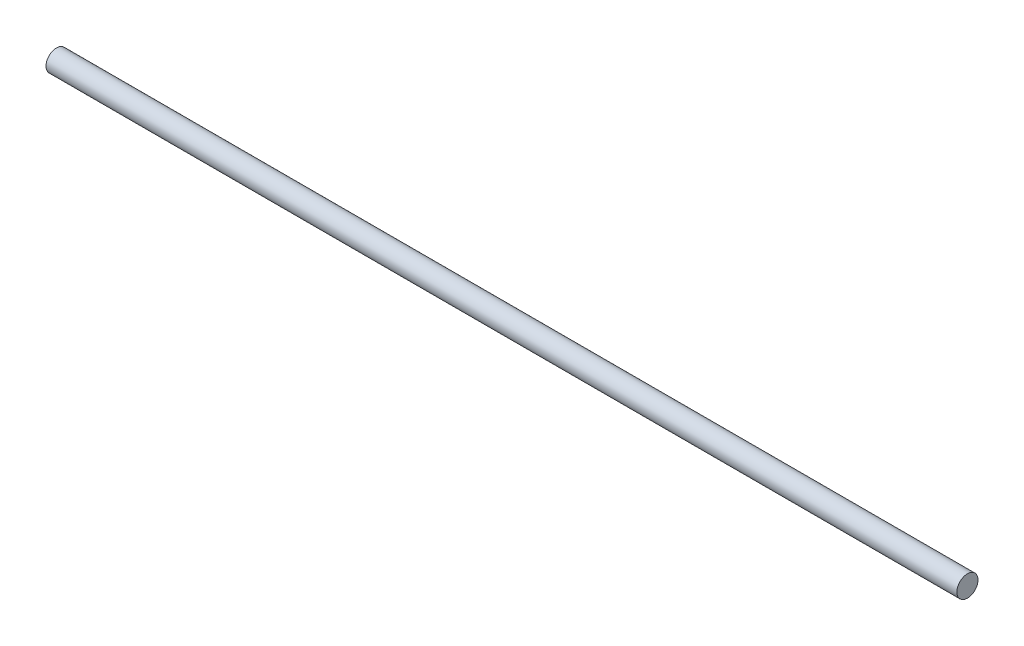
ISO-10303-21;
HEADER;
FILE_DESCRIPTION(('STEP AP214'),'2;1');
FILE_NAME('part.step','',(''),(''),'','','');
FILE_SCHEMA(('AUTOMOTIVE_DESIGN { 1 0 10303 214 1 1 1 1 }'));
ENDSEC;
DATA;
#1=APPLICATION_CONTEXT('core data for automotive mechanical design processes');
#2=APPLICATION_PROTOCOL_DEFINITION('international standard','automotive_design',2000,#1);
#3=PRODUCT_CONTEXT('',#1,'mechanical');
#4=PRODUCT('Part','Part','',(#3));
#5=PRODUCT_RELATED_PRODUCT_CATEGORY('part','',(#4));
#6=PRODUCT_DEFINITION_FORMATION('','',#4);
#7=PRODUCT_DEFINITION_CONTEXT('part definition',#1,'design');
#8=PRODUCT_DEFINITION('design','',#6,#7);
#9=PRODUCT_DEFINITION_SHAPE('','',#8);
#10=(LENGTH_UNIT() NAMED_UNIT(*) SI_UNIT(.MILLI.,.METRE.));
#11=(NAMED_UNIT(*) PLANE_ANGLE_UNIT() SI_UNIT($,.RADIAN.));
#12=(NAMED_UNIT(*) SI_UNIT($,.STERADIAN.) SOLID_ANGLE_UNIT());
#13=UNCERTAINTY_MEASURE_WITH_UNIT(LENGTH_MEASURE(1.E-05),#10,'distance_accuracy_value','');
#14=(GEOMETRIC_REPRESENTATION_CONTEXT(3) GLOBAL_UNCERTAINTY_ASSIGNED_CONTEXT((#13)) GLOBAL_UNIT_ASSIGNED_CONTEXT((#10,
#11,#12)) REPRESENTATION_CONTEXT('',''));
#15=CARTESIAN_POINT('',(0.,0.,0.));
#16=DIRECTION('',(0.,0.,1.));
#17=DIRECTION('',(1.,0.,0.));
#18=AXIS2_PLACEMENT_3D('',#15,#16,#17);
#19=CARTESIAN_POINT('',(215.5,0.,0.));
#20=DIRECTION('',(-1.,0.,0.));
#21=DIRECTION('',(0.,0.,1.));
#22=AXIS2_PLACEMENT_3D('',#19,#20,#21);
#23=CYLINDRICAL_SURFACE('',#22,5.);
#24=CARTESIAN_POINT('',(215.5,0.,0.));
#25=DIRECTION('',(1.,0.,0.));
#26=DIRECTION('',(0.,0.,-1.));
#27=AXIS2_PLACEMENT_3D('',#24,#25,#26);
#28=CIRCLE('',#27,5.);
#29=CARTESIAN_POINT('',(215.5,0.,-5.));
#30=VERTEX_POINT('',#29);
#31=EDGE_CURVE('E10',#30,#30,#28,.T.);
#32=ORIENTED_EDGE('',*,*,#31,.F.);
#33=EDGE_LOOP('',(#32));
#34=FACE_BOUND('',#33,.T.);
#35=CARTESIAN_POINT('',(-215.5,0.,0.));
#36=DIRECTION('',(1.,0.,0.));
#37=DIRECTION('',(0.,0.,-1.));
#38=AXIS2_PLACEMENT_3D('',#35,#36,#37);
#39=CIRCLE('',#38,5.);
#40=CARTESIAN_POINT('',(-215.5,0.,-5.));
#41=VERTEX_POINT('',#40);
#42=EDGE_CURVE('E34',#41,#41,#39,.T.);
#43=ORIENTED_EDGE('',*,*,#42,.T.);
#44=EDGE_LOOP('',(#43));
#45=FACE_BOUND('',#44,.T.);
#46=ADVANCED_FACE('F31',(#34,#45),#23,.T.);
#47=CARTESIAN_POINT('',(215.5,0.,0.));
#48=DIRECTION('',(1.,0.,0.));
#49=DIRECTION('',(0.,0.,-1.));
#50=AXIS2_PLACEMENT_3D('',#47,#48,#49);
#51=PLANE('',#50);
#52=ORIENTED_EDGE('',*,*,#31,.T.);
#53=EDGE_LOOP('',(#52));
#54=FACE_BOUND('',#53,.T.);
#55=ADVANCED_FACE('F46',(#54),#51,.T.);
#56=CARTESIAN_POINT('',(-215.5,0.,0.));
#57=DIRECTION('',(1.,0.,0.));
#58=DIRECTION('',(0.,0.,-1.));
#59=AXIS2_PLACEMENT_3D('',#56,#57,#58);
#60=PLANE('',#59);
#61=ORIENTED_EDGE('',*,*,#42,.F.);
#62=EDGE_LOOP('',(#61));
#63=FACE_BOUND('',#62,.T.);
#64=ADVANCED_FACE('F44',(#63),#60,.F.);
#65=CLOSED_SHELL('',(#46,#55,#64));
#66=MANIFOLD_SOLID_BREP('B2',#65);
#67=ADVANCED_BREP_SHAPE_REPRESENTATION('',(#18,#66),#14);
#68=SHAPE_DEFINITION_REPRESENTATION(#9,#67);
ENDSEC;
END-ISO-10303-21;
